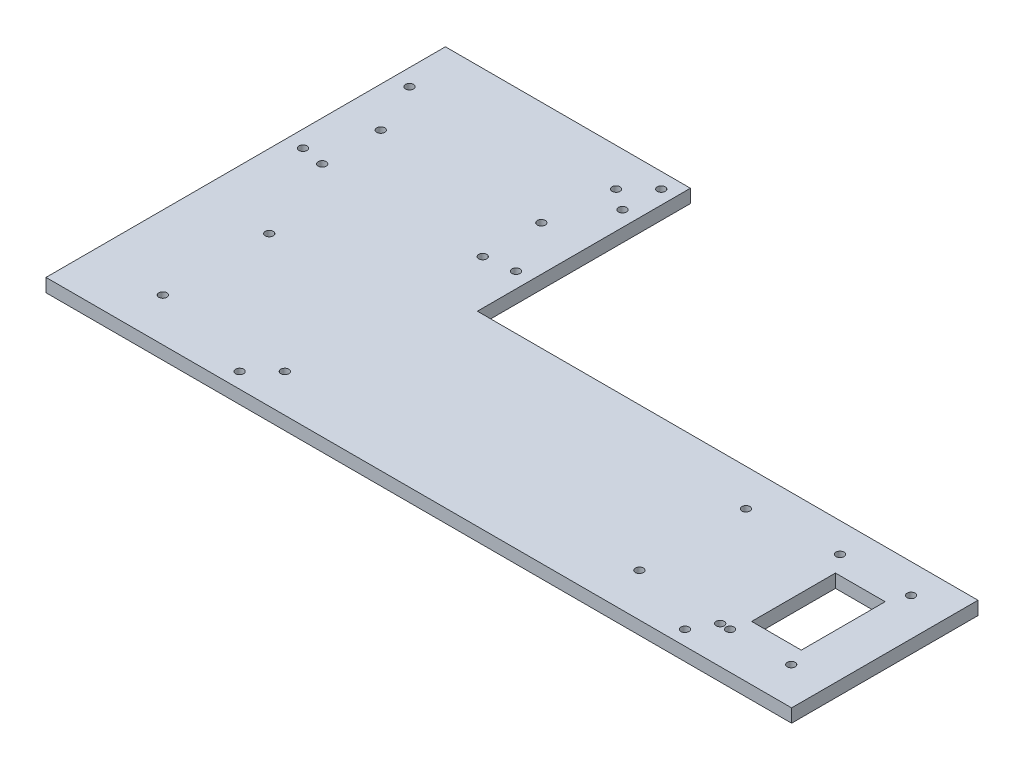
ISO-10303-21;
HEADER;
FILE_DESCRIPTION(('STEP AP214'),'2;1');
FILE_NAME('part.step','',(''),(''),'','','');
FILE_SCHEMA(('AUTOMOTIVE_DESIGN { 1 0 10303 214 1 1 1 1 }'));
ENDSEC;
DATA;
#1=APPLICATION_CONTEXT('core data for automotive mechanical design processes');
#2=APPLICATION_PROTOCOL_DEFINITION('international standard','automotive_design',2000,#1);
#3=PRODUCT_CONTEXT('',#1,'mechanical');
#4=PRODUCT('Part','Part','',(#3));
#5=PRODUCT_RELATED_PRODUCT_CATEGORY('part','',(#4));
#6=PRODUCT_DEFINITION_FORMATION('','',#4);
#7=PRODUCT_DEFINITION_CONTEXT('part definition',#1,'design');
#8=PRODUCT_DEFINITION('design','',#6,#7);
#9=PRODUCT_DEFINITION_SHAPE('','',#8);
#10=(LENGTH_UNIT() NAMED_UNIT(*) SI_UNIT(.MILLI.,.METRE.));
#11=(NAMED_UNIT(*) PLANE_ANGLE_UNIT() SI_UNIT($,.RADIAN.));
#12=(NAMED_UNIT(*) SI_UNIT($,.STERADIAN.) SOLID_ANGLE_UNIT());
#13=UNCERTAINTY_MEASURE_WITH_UNIT(LENGTH_MEASURE(1.E-05),#10,'distance_accuracy_value','');
#14=(GEOMETRIC_REPRESENTATION_CONTEXT(3) GLOBAL_UNCERTAINTY_ASSIGNED_CONTEXT((#13)) GLOBAL_UNIT_ASSIGNED_CONTEXT((#10,
#11,#12)) REPRESENTATION_CONTEXT('',''));
#15=CARTESIAN_POINT('',(0.,0.,0.));
#16=DIRECTION('',(0.,0.,1.));
#17=DIRECTION('',(1.,0.,0.));
#18=AXIS2_PLACEMENT_3D('',#15,#16,#17);
#19=CARTESIAN_POINT('',(0.,5.,60.7829181494663));
#20=DIRECTION('',(0.,0.,-1.));
#21=DIRECTION('',(-1.,0.,0.));
#22=AXIS2_PLACEMENT_3D('',#19,#20,#21);
#23=PLANE('',#22);
#24=DIRECTION('',(1.,0.,0.));
#25=VECTOR('',#24,1.);
#26=CARTESIAN_POINT('',(0.,0.,60.7829181494663));
#27=LINE('',#26,#25);
#28=CARTESIAN_POINT('',(-124.555160142349,0.,60.7829181494663));
#29=VERTEX_POINT('',#28);
#30=CARTESIAN_POINT('',(155.444839857651,0.,60.7829181494663));
#31=VERTEX_POINT('',#30);
#32=EDGE_CURVE('E268',#29,#31,#27,.T.);
#33=ORIENTED_EDGE('',*,*,#32,.T.);
#34=DIRECTION('',(0.,-1.,0.));
#35=VECTOR('',#34,1.);
#36=CARTESIAN_POINT('',(155.444839857651,5.,60.7829181494663));
#37=LINE('',#36,#35);
#38=CARTESIAN_POINT('',(155.444839857651,5.,60.7829181494663));
#39=VERTEX_POINT('',#38);
#40=EDGE_CURVE('E11',#39,#31,#37,.T.);
#41=ORIENTED_EDGE('',*,*,#40,.F.);
#42=DIRECTION('',(1.,0.,0.));
#43=VECTOR('',#42,1.);
#44=CARTESIAN_POINT('',(0.,5.,60.7829181494663));
#45=LINE('',#44,#43);
#46=CARTESIAN_POINT('',(-124.555160142349,5.,60.7829181494663));
#47=VERTEX_POINT('',#46);
#48=EDGE_CURVE('E368',#47,#39,#45,.T.);
#49=ORIENTED_EDGE('',*,*,#48,.F.);
#50=DIRECTION('',(0.,-1.,0.));
#51=VECTOR('',#50,1.);
#52=CARTESIAN_POINT('',(-124.555160142349,5.,60.7829181494663));
#53=LINE('',#52,#51);
#54=EDGE_CURVE('E65',#47,#29,#53,.T.);
#55=ORIENTED_EDGE('',*,*,#54,.T.);
#56=EDGE_LOOP('',(#33,#41,#49,#55));
#57=FACE_BOUND('',#56,.T.);
#58=ADVANCED_FACE('F45',(#57),#23,.F.);
#59=CARTESIAN_POINT('',(155.444839857651,5.,0.));
#60=DIRECTION('',(-1.,0.,0.));
#61=DIRECTION('',(0.,0.,1.));
#62=AXIS2_PLACEMENT_3D('',#59,#60,#61);
#63=PLANE('',#62);
#64=DIRECTION('',(0.,0.,-1.));
#65=VECTOR('',#64,1.);
#66=CARTESIAN_POINT('',(155.444839857651,0.,0.));
#67=LINE('',#66,#65);
#68=CARTESIAN_POINT('',(155.444839857651,0.,-9.21708185053371));
#69=VERTEX_POINT('',#68);
#70=EDGE_CURVE('E271',#31,#69,#67,.T.);
#71=ORIENTED_EDGE('',*,*,#70,.T.);
#72=DIRECTION('',(0.,-1.,0.));
#73=VECTOR('',#72,1.);
#74=CARTESIAN_POINT('',(155.444839857651,5.,-9.21708185053371));
#75=LINE('',#74,#73);
#76=CARTESIAN_POINT('',(155.444839857651,5.,-9.21708185053371));
#77=VERTEX_POINT('',#76);
#78=EDGE_CURVE('E56',#77,#69,#75,.T.);
#79=ORIENTED_EDGE('',*,*,#78,.F.);
#80=DIRECTION('',(0.,0.,-1.));
#81=VECTOR('',#80,1.);
#82=CARTESIAN_POINT('',(155.444839857651,5.,0.));
#83=LINE('',#82,#81);
#84=EDGE_CURVE('E379',#39,#77,#83,.T.);
#85=ORIENTED_EDGE('',*,*,#84,.F.);
#86=ORIENTED_EDGE('',*,*,#40,.T.);
#87=EDGE_LOOP('',(#71,#79,#85,#86));
#88=FACE_BOUND('',#87,.T.);
#89=ADVANCED_FACE('F402',(#88),#63,.F.);
#90=CARTESIAN_POINT('',(0.,5.,-9.21708185053371));
#91=DIRECTION('',(0.,0.,-1.));
#92=DIRECTION('',(-1.,0.,0.));
#93=AXIS2_PLACEMENT_3D('',#90,#91,#92);
#94=PLANE('',#93);
#95=DIRECTION('',(1.,0.,0.));
#96=VECTOR('',#95,1.);
#97=CARTESIAN_POINT('',(0.,0.,-9.21708185053371));
#98=LINE('',#97,#96);
#99=CARTESIAN_POINT('',(-32.5551601423487,0.,-9.21708185053371));
#100=VERTEX_POINT('',#99);
#101=EDGE_CURVE('E275',#100,#69,#98,.T.);
#102=ORIENTED_EDGE('',*,*,#101,.F.);
#103=DIRECTION('',(0.,-1.,0.));
#104=VECTOR('',#103,1.);
#105=CARTESIAN_POINT('',(-32.5551601423487,5.,-9.21708185053371));
#106=LINE('',#105,#104);
#107=CARTESIAN_POINT('',(-32.5551601423487,5.,-9.21708185053371));
#108=VERTEX_POINT('',#107);
#109=EDGE_CURVE('E153',#108,#100,#106,.T.);
#110=ORIENTED_EDGE('',*,*,#109,.F.);
#111=DIRECTION('',(1.,0.,0.));
#112=VECTOR('',#111,1.);
#113=CARTESIAN_POINT('',(0.,5.,-9.21708185053371));
#114=LINE('',#113,#112);
#115=EDGE_CURVE('E141',#108,#77,#114,.T.);
#116=ORIENTED_EDGE('',*,*,#115,.T.);
#117=ORIENTED_EDGE('',*,*,#78,.T.);
#118=EDGE_LOOP('',(#102,#110,#116,#117));
#119=FACE_BOUND('',#118,.T.);
#120=ADVANCED_FACE('F384',(#119),#94,.T.);
#121=CARTESIAN_POINT('',(-32.5551601423487,5.,0.));
#122=DIRECTION('',(-1.,0.,0.));
#123=DIRECTION('',(0.,0.,1.));
#124=AXIS2_PLACEMENT_3D('',#121,#122,#123);
#125=PLANE('',#124);
#126=DIRECTION('',(0.,0.,-1.));
#127=VECTOR('',#126,1.);
#128=CARTESIAN_POINT('',(-32.5551601423487,0.,0.));
#129=LINE('',#128,#127);
#130=CARTESIAN_POINT('',(-32.5551601423487,0.,-89.2170818505337));
#131=VERTEX_POINT('',#130);
#132=EDGE_CURVE('E149',#100,#131,#129,.T.);
#133=ORIENTED_EDGE('',*,*,#132,.T.);
#134=DIRECTION('',(0.,-1.,0.));
#135=VECTOR('',#134,1.);
#136=CARTESIAN_POINT('',(-32.5551601423487,5.,-89.2170818505337));
#137=LINE('',#136,#135);
#138=CARTESIAN_POINT('',(-32.5551601423487,5.,-89.2170818505337));
#139=VERTEX_POINT('',#138);
#140=EDGE_CURVE('E146',#139,#131,#137,.T.);
#141=ORIENTED_EDGE('',*,*,#140,.F.);
#142=DIRECTION('',(0.,0.,-1.));
#143=VECTOR('',#142,1.);
#144=CARTESIAN_POINT('',(-32.5551601423487,5.,0.));
#145=LINE('',#144,#143);
#146=EDGE_CURVE('E132',#108,#139,#145,.T.);
#147=ORIENTED_EDGE('',*,*,#146,.F.);
#148=ORIENTED_EDGE('',*,*,#109,.T.);
#149=EDGE_LOOP('',(#133,#141,#147,#148));
#150=FACE_BOUND('',#149,.T.);
#151=ADVANCED_FACE('F147',(#150),#125,.F.);
#152=CARTESIAN_POINT('',(0.,5.,-89.2170818505337));
#153=DIRECTION('',(0.,0.,-1.));
#154=DIRECTION('',(-1.,0.,0.));
#155=AXIS2_PLACEMENT_3D('',#152,#153,#154);
#156=PLANE('',#155);
#157=DIRECTION('',(1.,0.,0.));
#158=VECTOR('',#157,1.);
#159=CARTESIAN_POINT('',(0.,0.,-89.2170818505337));
#160=LINE('',#159,#158);
#161=CARTESIAN_POINT('',(-124.555160142349,0.,-89.2170818505337));
#162=VERTEX_POINT('',#161);
#163=EDGE_CURVE('E281',#162,#131,#160,.T.);
#164=ORIENTED_EDGE('',*,*,#163,.F.);
#165=DIRECTION('',(0.,-1.,0.));
#166=VECTOR('',#165,1.);
#167=CARTESIAN_POINT('',(-124.555160142349,5.,-89.2170818505337));
#168=LINE('',#167,#166);
#169=CARTESIAN_POINT('',(-124.555160142349,5.,-89.2170818505337));
#170=VERTEX_POINT('',#169);
#171=EDGE_CURVE('E97',#170,#162,#168,.T.);
#172=ORIENTED_EDGE('',*,*,#171,.F.);
#173=DIRECTION('',(1.,0.,0.));
#174=VECTOR('',#173,1.);
#175=CARTESIAN_POINT('',(0.,5.,-89.2170818505337));
#176=LINE('',#175,#174);
#177=EDGE_CURVE('E139',#170,#139,#176,.T.);
#178=ORIENTED_EDGE('',*,*,#177,.T.);
#179=ORIENTED_EDGE('',*,*,#140,.T.);
#180=EDGE_LOOP('',(#164,#172,#178,#179));
#181=FACE_BOUND('',#180,.T.);
#182=ADVANCED_FACE('F155',(#181),#156,.T.);
#183=CARTESIAN_POINT('',(138.489369903126,5.,0.));
#184=DIRECTION('',(-1.,0.,0.));
#185=DIRECTION('',(0.,0.,1.));
#186=AXIS2_PLACEMENT_3D('',#183,#184,#185);
#187=PLANE('',#186);
#188=DIRECTION('',(0.,0.,-1.));
#189=VECTOR('',#188,1.);
#190=CARTESIAN_POINT('',(138.489369903126,0.,0.));
#191=LINE('',#190,#189);
#192=CARTESIAN_POINT('',(138.489369903126,0.,40.1838438087664));
#193=VERTEX_POINT('',#192);
#194=CARTESIAN_POINT('',(138.489369903126,0.,8.69680571503078));
#195=VERTEX_POINT('',#194);
#196=EDGE_CURVE('E252',#193,#195,#191,.T.);
#197=ORIENTED_EDGE('',*,*,#196,.F.);
#198=DIRECTION('',(0.,-1.,0.));
#199=VECTOR('',#198,1.);
#200=CARTESIAN_POINT('',(138.489369903126,5.,40.1838438087664));
#201=LINE('',#200,#199);
#202=CARTESIAN_POINT('',(138.489369903126,5.,40.1838438087664));
#203=VERTEX_POINT('',#202);
#204=EDGE_CURVE('E49',#203,#193,#201,.T.);
#205=ORIENTED_EDGE('',*,*,#204,.F.);
#206=DIRECTION('',(0.,0.,-1.));
#207=VECTOR('',#206,1.);
#208=CARTESIAN_POINT('',(138.489369903126,5.,0.));
#209=LINE('',#208,#207);
#210=CARTESIAN_POINT('',(138.489369903126,5.,8.69680571503078));
#211=VERTEX_POINT('',#210);
#212=EDGE_CURVE('E373',#203,#211,#209,.T.);
#213=ORIENTED_EDGE('',*,*,#212,.T.);
#214=DIRECTION('',(0.,-1.,0.));
#215=VECTOR('',#214,1.);
#216=CARTESIAN_POINT('',(138.489369903126,5.,8.69680571503078));
#217=LINE('',#216,#215);
#218=EDGE_CURVE('E203',#211,#195,#217,.T.);
#219=ORIENTED_EDGE('',*,*,#218,.T.);
#220=EDGE_LOOP('',(#197,#205,#213,#219));
#221=FACE_BOUND('',#220,.T.);
#222=ADVANCED_FACE('F354',(#221),#187,.T.);
#223=CARTESIAN_POINT('',(0.,5.,40.1838438087664));
#224=DIRECTION('',(0.,0.,-1.));
#225=DIRECTION('',(-1.,0.,0.));
#226=AXIS2_PLACEMENT_3D('',#223,#224,#225);
#227=PLANE('',#226);
#228=DIRECTION('',(1.,0.,0.));
#229=VECTOR('',#228,1.);
#230=CARTESIAN_POINT('',(0.,0.,40.1838438087664));
#231=LINE('',#230,#229);
#232=CARTESIAN_POINT('',(119.830384366097,0.,40.1838438087664));
#233=VERTEX_POINT('',#232);
#234=EDGE_CURVE('E256',#233,#193,#231,.T.);
#235=ORIENTED_EDGE('',*,*,#234,.F.);
#236=DIRECTION('',(0.,-1.,0.));
#237=VECTOR('',#236,1.);
#238=CARTESIAN_POINT('',(119.830384366097,5.,40.1838438087664));
#239=LINE('',#238,#237);
#240=CARTESIAN_POINT('',(119.830384366097,5.,40.1838438087664));
#241=VERTEX_POINT('',#240);
#242=EDGE_CURVE('E342',#241,#233,#239,.T.);
#243=ORIENTED_EDGE('',*,*,#242,.F.);
#244=DIRECTION('',(1.,0.,0.));
#245=VECTOR('',#244,1.);
#246=CARTESIAN_POINT('',(0.,5.,40.1838438087664));
#247=LINE('',#246,#245);
#248=EDGE_CURVE('E353',#241,#203,#247,.T.);
#249=ORIENTED_EDGE('',*,*,#248,.T.);
#250=ORIENTED_EDGE('',*,*,#204,.T.);
#251=EDGE_LOOP('',(#235,#243,#249,#250));
#252=FACE_BOUND('',#251,.T.);
#253=ADVANCED_FACE('F351',(#252),#227,.T.);
#254=CARTESIAN_POINT('',(119.830384366097,5.,0.));
#255=DIRECTION('',(-1.,0.,0.));
#256=DIRECTION('',(0.,0.,1.));
#257=AXIS2_PLACEMENT_3D('',#254,#255,#256);
#258=PLANE('',#257);
#259=DIRECTION('',(0.,0.,-1.));
#260=VECTOR('',#259,1.);
#261=CARTESIAN_POINT('',(119.830384366097,0.,0.));
#262=LINE('',#261,#260);
#263=CARTESIAN_POINT('',(119.830384366097,0.,8.69680571503078));
#264=VERTEX_POINT('',#263);
#265=EDGE_CURVE('E260',#233,#264,#262,.T.);
#266=ORIENTED_EDGE('',*,*,#265,.T.);
#267=DIRECTION('',(0.,-1.,0.));
#268=VECTOR('',#267,1.);
#269=CARTESIAN_POINT('',(119.830384366097,5.,8.69680571503078));
#270=LINE('',#269,#268);
#271=CARTESIAN_POINT('',(119.830384366097,5.,8.69680571503078));
#272=VERTEX_POINT('',#271);
#273=EDGE_CURVE('E339',#272,#264,#270,.T.);
#274=ORIENTED_EDGE('',*,*,#273,.F.);
#275=DIRECTION('',(0.,0.,-1.));
#276=VECTOR('',#275,1.);
#277=CARTESIAN_POINT('',(119.830384366097,5.,0.));
#278=LINE('',#277,#276);
#279=EDGE_CURVE('E362',#241,#272,#278,.T.);
#280=ORIENTED_EDGE('',*,*,#279,.F.);
#281=ORIENTED_EDGE('',*,*,#242,.T.);
#282=EDGE_LOOP('',(#266,#274,#280,#281));
#283=FACE_BOUND('',#282,.T.);
#284=ADVANCED_FACE('F360',(#283),#258,.F.);
#285=CARTESIAN_POINT('',(-46.2375364699108,5.,-74.9744411634144));
#286=DIRECTION('',(0.,-1.,0.));
#287=DIRECTION('',(0.,0.,-1.));
#288=AXIS2_PLACEMENT_3D('',#285,#286,#287);
#289=CYLINDRICAL_SURFACE('',#288,1.5);
#290=CARTESIAN_POINT('',(-46.2375364699108,5.,-74.9744411634144));
#291=DIRECTION('',(0.,1.,0.));
#292=DIRECTION('',(0.,0.,1.));
#293=AXIS2_PLACEMENT_3D('',#290,#291,#292);
#294=CIRCLE('',#293,1.5);
#295=CARTESIAN_POINT('',(-46.2375364699108,5.,-73.4744411634144));
#296=VERTEX_POINT('',#295);
#297=EDGE_CURVE('E195',#296,#296,#294,.T.);
#298=ORIENTED_EDGE('',*,*,#297,.T.);
#299=EDGE_LOOP('',(#298));
#300=FACE_BOUND('',#299,.T.);
#301=CARTESIAN_POINT('',(-46.2375364699108,0.,-74.9744411634144));
#302=DIRECTION('',(0.,1.,0.));
#303=DIRECTION('',(0.,0.,1.));
#304=AXIS2_PLACEMENT_3D('',#301,#302,#303);
#305=CIRCLE('',#304,1.5);
#306=CARTESIAN_POINT('',(-46.2375364699108,0.,-73.4744411634144));
#307=VERTEX_POINT('',#306);
#308=EDGE_CURVE('E320',#307,#307,#305,.T.);
#309=ORIENTED_EDGE('',*,*,#308,.F.);
#310=EDGE_LOOP('',(#309));
#311=FACE_BOUND('',#310,.T.);
#312=ADVANCED_FACE('F413',(#300,#311),#289,.F.);
#313=CARTESIAN_POINT('',(-118.326917326032,5.,-69.4952757105542));
#314=DIRECTION('',(0.,-1.,0.));
#315=DIRECTION('',(0.,0.,-1.));
#316=AXIS2_PLACEMENT_3D('',#313,#314,#315);
#317=CYLINDRICAL_SURFACE('',#316,1.50000000000001);
#318=CARTESIAN_POINT('',(-118.326917326032,5.,-69.4952757105542));
#319=DIRECTION('',(0.,1.,0.));
#320=DIRECTION('',(0.,0.,1.));
#321=AXIS2_PLACEMENT_3D('',#318,#319,#320);
#322=CIRCLE('',#321,1.50000000000001);
#323=CARTESIAN_POINT('',(-118.326917326032,5.,-67.9952757105542));
#324=VERTEX_POINT('',#323);
#325=EDGE_CURVE('E191',#324,#324,#322,.T.);
#326=ORIENTED_EDGE('',*,*,#325,.T.);
#327=EDGE_LOOP('',(#326));
#328=FACE_BOUND('',#327,.T.);
#329=CARTESIAN_POINT('',(-118.326917326032,0.,-69.4952757105542));
#330=DIRECTION('',(0.,1.,0.));
#331=DIRECTION('',(0.,0.,1.));
#332=AXIS2_PLACEMENT_3D('',#329,#330,#331);
#333=CIRCLE('',#332,1.50000000000001);
#334=CARTESIAN_POINT('',(-118.326917326032,0.,-67.9952757105542));
#335=VERTEX_POINT('',#334);
#336=EDGE_CURVE('E316',#335,#335,#333,.T.);
#337=ORIENTED_EDGE('',*,*,#336,.F.);
#338=EDGE_LOOP('',(#337));
#339=FACE_BOUND('',#338,.T.);
#340=ADVANCED_FACE('F514',(#328,#339),#317,.F.);
#341=CARTESIAN_POINT('',(-118.326917326032,5.,-29.4952757105542));
#342=DIRECTION('',(0.,-1.,0.));
#343=DIRECTION('',(0.,0.,-1.));
#344=AXIS2_PLACEMENT_3D('',#341,#342,#343);
#345=CYLINDRICAL_SURFACE('',#344,1.5);
#346=CARTESIAN_POINT('',(-118.326917326032,5.,-29.4952757105542));
#347=DIRECTION('',(0.,1.,0.));
#348=DIRECTION('',(0.,0.,1.));
#349=AXIS2_PLACEMENT_3D('',#346,#347,#348);
#350=CIRCLE('',#349,1.5);
#351=CARTESIAN_POINT('',(-118.326917326032,5.,-27.9952757105542));
#352=VERTEX_POINT('',#351);
#353=EDGE_CURVE('E187',#352,#352,#350,.T.);
#354=ORIENTED_EDGE('',*,*,#353,.T.);
#355=EDGE_LOOP('',(#354));
#356=FACE_BOUND('',#355,.T.);
#357=CARTESIAN_POINT('',(-118.326917326032,0.,-29.4952757105542));
#358=DIRECTION('',(0.,1.,0.));
#359=DIRECTION('',(0.,0.,1.));
#360=AXIS2_PLACEMENT_3D('',#357,#358,#359);
#361=CIRCLE('',#360,1.5);
#362=CARTESIAN_POINT('',(-118.326917326032,0.,-27.9952757105542));
#363=VERTEX_POINT('',#362);
#364=EDGE_CURVE('E312',#363,#363,#361,.T.);
#365=ORIENTED_EDGE('',*,*,#364,.F.);
#366=EDGE_LOOP('',(#365));
#367=FACE_BOUND('',#366,.T.);
#368=ADVANCED_FACE('F518',(#356,#367),#345,.F.);
#369=CARTESIAN_POINT('',(-38.3269173260317,5.,-29.4952757105542));
#370=DIRECTION('',(0.,-1.,0.));
#371=DIRECTION('',(0.,0.,-1.));
#372=AXIS2_PLACEMENT_3D('',#369,#370,#371);
#373=CYLINDRICAL_SURFACE('',#372,1.5);
#374=CARTESIAN_POINT('',(-38.3269173260317,5.,-29.4952757105542));
#375=DIRECTION('',(0.,1.,0.));
#376=DIRECTION('',(0.,0.,1.));
#377=AXIS2_PLACEMENT_3D('',#374,#375,#376);
#378=CIRCLE('',#377,1.5);
#379=CARTESIAN_POINT('',(-38.3269173260317,5.,-27.9952757105542));
#380=VERTEX_POINT('',#379);
#381=EDGE_CURVE('E183',#380,#380,#378,.T.);
#382=ORIENTED_EDGE('',*,*,#381,.T.);
#383=EDGE_LOOP('',(#382));
#384=FACE_BOUND('',#383,.T.);
#385=CARTESIAN_POINT('',(-38.3269173260317,0.,-29.4952757105542));
#386=DIRECTION('',(0.,1.,0.));
#387=DIRECTION('',(0.,0.,1.));
#388=AXIS2_PLACEMENT_3D('',#385,#386,#387);
#389=CIRCLE('',#388,1.5);
#390=CARTESIAN_POINT('',(-38.3269173260317,0.,-27.9952757105542));
#391=VERTEX_POINT('',#390);
#392=EDGE_CURVE('E308',#391,#391,#389,.T.);
#393=ORIENTED_EDGE('',*,*,#392,.F.);
#394=EDGE_LOOP('',(#393));
#395=FACE_BOUND('',#394,.T.);
#396=ADVANCED_FACE('F522',(#384,#395),#373,.F.);
#397=CARTESIAN_POINT('',(-38.3269173260317,5.,-69.4952757105542));
#398=DIRECTION('',(0.,-1.,0.));
#399=DIRECTION('',(0.,0.,-1.));
#400=AXIS2_PLACEMENT_3D('',#397,#398,#399);
#401=CYLINDRICAL_SURFACE('',#400,1.5);
#402=CARTESIAN_POINT('',(-38.3269173260317,5.,-69.4952757105542));
#403=DIRECTION('',(0.,1.,0.));
#404=DIRECTION('',(0.,0.,1.));
#405=AXIS2_PLACEMENT_3D('',#402,#403,#404);
#406=CIRCLE('',#405,1.5);
#407=CARTESIAN_POINT('',(-38.3269173260317,5.,-67.9952757105542));
#408=VERTEX_POINT('',#407);
#409=EDGE_CURVE('E179',#408,#408,#406,.T.);
#410=ORIENTED_EDGE('',*,*,#409,.T.);
#411=EDGE_LOOP('',(#410));
#412=FACE_BOUND('',#411,.T.);
#413=CARTESIAN_POINT('',(-38.3269173260317,0.,-69.4952757105542));
#414=DIRECTION('',(0.,1.,0.));
#415=DIRECTION('',(0.,0.,1.));
#416=AXIS2_PLACEMENT_3D('',#413,#414,#415);
#417=CIRCLE('',#416,1.5);
#418=CARTESIAN_POINT('',(-38.3269173260317,0.,-67.9952757105542));
#419=VERTEX_POINT('',#418);
#420=EDGE_CURVE('E304',#419,#419,#417,.T.);
#421=ORIENTED_EDGE('',*,*,#420,.F.);
#422=EDGE_LOOP('',(#421));
#423=FACE_BOUND('',#422,.T.);
#424=ADVANCED_FACE('F526',(#412,#423),#401,.F.);
#425=CARTESIAN_POINT('',(-109.616514697258,5.,-49.9907257311618));
#426=DIRECTION('',(0.,-1.,0.));
#427=DIRECTION('',(0.,0.,-1.));
#428=AXIS2_PLACEMENT_3D('',#425,#426,#427);
#429=CYLINDRICAL_SURFACE('',#428,1.50000000000001);
#430=CARTESIAN_POINT('',(-109.616514697258,5.,-49.9907257311618));
#431=DIRECTION('',(0.,1.,0.));
#432=DIRECTION('',(0.,0.,1.));
#433=AXIS2_PLACEMENT_3D('',#430,#431,#432);
#434=CIRCLE('',#433,1.50000000000001);
#435=CARTESIAN_POINT('',(-109.616514697258,5.,-48.4907257311618));
#436=VERTEX_POINT('',#435);
#437=EDGE_CURVE('E175',#436,#436,#434,.T.);
#438=ORIENTED_EDGE('',*,*,#437,.T.);
#439=EDGE_LOOP('',(#438));
#440=FACE_BOUND('',#439,.T.);
#441=CARTESIAN_POINT('',(-109.616514697258,0.,-49.9907257311618));
#442=DIRECTION('',(0.,1.,0.));
#443=DIRECTION('',(0.,0.,1.));
#444=AXIS2_PLACEMENT_3D('',#441,#442,#443);
#445=CIRCLE('',#444,1.50000000000001);
#446=CARTESIAN_POINT('',(-109.616514697258,0.,-48.4907257311618));
#447=VERTEX_POINT('',#446);
#448=EDGE_CURVE('E300',#447,#447,#445,.T.);
#449=ORIENTED_EDGE('',*,*,#448,.F.);
#450=EDGE_LOOP('',(#449));
#451=FACE_BOUND('',#450,.T.);
#452=ADVANCED_FACE('F530',(#440,#451),#429,.F.);
#453=CARTESIAN_POINT('',(-109.616514697258,5.,-27.9907257311618));
#454=DIRECTION('',(0.,-1.,0.));
#455=DIRECTION('',(0.,0.,-1.));
#456=AXIS2_PLACEMENT_3D('',#453,#454,#455);
#457=CYLINDRICAL_SURFACE('',#456,1.5);
#458=CARTESIAN_POINT('',(-109.616514697258,5.,-27.9907257311618));
#459=DIRECTION('',(0.,1.,0.));
#460=DIRECTION('',(0.,0.,1.));
#461=AXIS2_PLACEMENT_3D('',#458,#459,#460);
#462=CIRCLE('',#461,1.5);
#463=CARTESIAN_POINT('',(-109.616514697258,5.,-26.4907257311618));
#464=VERTEX_POINT('',#463);
#465=EDGE_CURVE('E171',#464,#464,#462,.T.);
#466=ORIENTED_EDGE('',*,*,#465,.T.);
#467=EDGE_LOOP('',(#466));
#468=FACE_BOUND('',#467,.T.);
#469=CARTESIAN_POINT('',(-109.616514697258,0.,-27.9907257311618));
#470=DIRECTION('',(0.,1.,0.));
#471=DIRECTION('',(0.,0.,1.));
#472=AXIS2_PLACEMENT_3D('',#469,#470,#471);
#473=CIRCLE('',#472,1.5);
#474=CARTESIAN_POINT('',(-109.616514697258,0.,-26.4907257311618));
#475=VERTEX_POINT('',#474);
#476=EDGE_CURVE('E296',#475,#475,#473,.T.);
#477=ORIENTED_EDGE('',*,*,#476,.F.);
#478=EDGE_LOOP('',(#477));
#479=FACE_BOUND('',#478,.T.);
#480=ADVANCED_FACE('F534',(#468,#479),#457,.F.);
#481=CARTESIAN_POINT('',(-49.316514697258,5.,-49.9907257311618));
#482=DIRECTION('',(0.,-1.,0.));
#483=DIRECTION('',(0.,0.,-1.));
#484=AXIS2_PLACEMENT_3D('',#481,#482,#483);
#485=CYLINDRICAL_SURFACE('',#484,1.5);
#486=CARTESIAN_POINT('',(-49.316514697258,5.,-49.9907257311618));
#487=DIRECTION('',(0.,1.,0.));
#488=DIRECTION('',(0.,0.,1.));
#489=AXIS2_PLACEMENT_3D('',#486,#487,#488);
#490=CIRCLE('',#489,1.5);
#491=CARTESIAN_POINT('',(-49.316514697258,5.,-48.4907257311618));
#492=VERTEX_POINT('',#491);
#493=EDGE_CURVE('E167',#492,#492,#490,.T.);
#494=ORIENTED_EDGE('',*,*,#493,.T.);
#495=EDGE_LOOP('',(#494));
#496=FACE_BOUND('',#495,.T.);
#497=CARTESIAN_POINT('',(-49.316514697258,0.,-49.9907257311618));
#498=DIRECTION('',(0.,1.,0.));
#499=DIRECTION('',(0.,0.,1.));
#500=AXIS2_PLACEMENT_3D('',#497,#498,#499);
#501=CIRCLE('',#500,1.5);
#502=CARTESIAN_POINT('',(-49.316514697258,0.,-48.4907257311618));
#503=VERTEX_POINT('',#502);
#504=EDGE_CURVE('E292',#503,#503,#501,.T.);
#505=ORIENTED_EDGE('',*,*,#504,.F.);
#506=EDGE_LOOP('',(#505));
#507=FACE_BOUND('',#506,.T.);
#508=ADVANCED_FACE('F397',(#496,#507),#485,.F.);
#509=CARTESIAN_POINT('',(-49.316514697258,5.,-27.9907257311618));
#510=DIRECTION('',(0.,-1.,0.));
#511=DIRECTION('',(0.,0.,-1.));
#512=AXIS2_PLACEMENT_3D('',#509,#510,#511);
#513=CYLINDRICAL_SURFACE('',#512,1.5);
#514=CARTESIAN_POINT('',(-49.316514697258,5.,-27.9907257311618));
#515=DIRECTION('',(0.,1.,0.));
#516=DIRECTION('',(0.,0.,1.));
#517=AXIS2_PLACEMENT_3D('',#514,#515,#516);
#518=CIRCLE('',#517,1.5);
#519=CARTESIAN_POINT('',(-49.316514697258,5.,-26.4907257311618));
#520=VERTEX_POINT('',#519);
#521=EDGE_CURVE('E160',#520,#520,#518,.T.);
#522=ORIENTED_EDGE('',*,*,#521,.T.);
#523=EDGE_LOOP('',(#522));
#524=FACE_BOUND('',#523,.T.);
#525=CARTESIAN_POINT('',(-49.316514697258,0.,-27.9907257311618));
#526=DIRECTION('',(0.,1.,0.));
#527=DIRECTION('',(0.,0.,1.));
#528=AXIS2_PLACEMENT_3D('',#525,#526,#527);
#529=CIRCLE('',#528,1.5);
#530=CARTESIAN_POINT('',(-49.316514697258,0.,-26.4907257311618));
#531=VERTEX_POINT('',#530);
#532=EDGE_CURVE('E288',#531,#531,#529,.T.);
#533=ORIENTED_EDGE('',*,*,#532,.F.);
#534=EDGE_LOOP('',(#533));
#535=FACE_BOUND('',#534,.T.);
#536=ADVANCED_FACE('F389',(#524,#535),#513,.F.);
#537=CARTESIAN_POINT('',(-124.555160142349,5.,0.));
#538=DIRECTION('',(-1.,0.,0.));
#539=DIRECTION('',(0.,0.,1.));
#540=AXIS2_PLACEMENT_3D('',#537,#538,#539);
#541=PLANE('',#540);
#542=DIRECTION('',(0.,0.,-1.));
#543=VECTOR('',#542,1.);
#544=CARTESIAN_POINT('',(-124.555160142349,0.,0.));
#545=LINE('',#544,#543);
#546=EDGE_CURVE('E284',#29,#162,#545,.T.);
#547=ORIENTED_EDGE('',*,*,#546,.F.);
#548=ORIENTED_EDGE('',*,*,#54,.F.);
#549=DIRECTION('',(0.,0.,-1.));
#550=VECTOR('',#549,1.);
#551=CARTESIAN_POINT('',(-124.555160142349,5.,0.));
#552=LINE('',#551,#550);
#553=EDGE_CURVE('E157',#47,#170,#552,.T.);
#554=ORIENTED_EDGE('',*,*,#553,.T.);
#555=ORIENTED_EDGE('',*,*,#171,.T.);
#556=EDGE_LOOP('',(#547,#548,#554,#555));
#557=FACE_BOUND('',#556,.T.);
#558=ADVANCED_FACE('F387',(#557),#541,.T.);
#559=CARTESIAN_POINT('',(0.,5.,8.69680571503078));
#560=DIRECTION('',(0.,0.,-1.));
#561=DIRECTION('',(-1.,0.,0.));
#562=AXIS2_PLACEMENT_3D('',#559,#560,#561);
#563=PLANE('',#562);
#564=DIRECTION('',(1.,0.,0.));
#565=VECTOR('',#564,1.);
#566=CARTESIAN_POINT('',(0.,0.,8.69680571503078));
#567=LINE('',#566,#565);
#568=EDGE_CURVE('E264',#264,#195,#567,.T.);
#569=ORIENTED_EDGE('',*,*,#568,.T.);
#570=ORIENTED_EDGE('',*,*,#218,.F.);
#571=DIRECTION('',(1.,0.,0.));
#572=VECTOR('',#571,1.);
#573=CARTESIAN_POINT('',(0.,5.,8.69680571503078));
#574=LINE('',#573,#572);
#575=EDGE_CURVE('E365',#272,#211,#574,.T.);
#576=ORIENTED_EDGE('',*,*,#575,.F.);
#577=ORIENTED_EDGE('',*,*,#273,.T.);
#578=EDGE_LOOP('',(#569,#570,#576,#577));
#579=FACE_BOUND('',#578,.T.);
#580=ADVANCED_FACE('F364',(#579),#563,.F.);
#581=CARTESIAN_POINT('',(141.300092758163,5.,46.7829181494663));
#582=DIRECTION('',(0.,-1.,0.));
#583=DIRECTION('',(0.,0.,-1.));
#584=AXIS2_PLACEMENT_3D('',#581,#582,#583);
#585=CYLINDRICAL_SURFACE('',#584,1.5);
#586=CARTESIAN_POINT('',(141.300092758163,5.,46.7829181494663));
#587=DIRECTION('',(0.,1.,0.));
#588=DIRECTION('',(0.,0.,1.));
#589=AXIS2_PLACEMENT_3D('',#586,#587,#588);
#590=CIRCLE('',#589,1.5);
#591=CARTESIAN_POINT('',(141.300092758163,5.,48.2829181494663));
#592=VERTEX_POINT('',#591);
#593=EDGE_CURVE('E907',#592,#592,#590,.T.);
#594=ORIENTED_EDGE('',*,*,#593,.T.);
#595=EDGE_LOOP('',(#594));
#596=FACE_BOUND('',#595,.T.);
#597=CARTESIAN_POINT('',(141.300092758163,0.,46.7829181494663));
#598=DIRECTION('',(0.,1.,0.));
#599=DIRECTION('',(0.,0.,1.));
#600=AXIS2_PLACEMENT_3D('',#597,#598,#599);
#601=CIRCLE('',#600,1.5);
#602=CARTESIAN_POINT('',(141.300092758163,0.,48.2829181494663));
#603=VERTEX_POINT('',#602);
#604=EDGE_CURVE('E248',#603,#603,#601,.T.);
#605=ORIENTED_EDGE('',*,*,#604,.F.);
#606=EDGE_LOOP('',(#605));
#607=FACE_BOUND('',#606,.T.);
#608=ADVANCED_FACE('F395',(#596,#607),#585,.F.);
#609=CARTESIAN_POINT('',(141.300092758163,5.,1.78291814946631));
#610=DIRECTION('',(0.,-1.,0.));
#611=DIRECTION('',(0.,0.,-1.));
#612=AXIS2_PLACEMENT_3D('',#609,#610,#611);
#613=CYLINDRICAL_SURFACE('',#612,1.5);
#614=CARTESIAN_POINT('',(141.300092758163,5.,1.78291814946631));
#615=DIRECTION('',(0.,1.,0.));
#616=DIRECTION('',(0.,0.,1.));
#617=AXIS2_PLACEMENT_3D('',#614,#615,#616);
#618=CIRCLE('',#617,1.5);
#619=CARTESIAN_POINT('',(141.300092758163,5.,3.28291814946631));
#620=VERTEX_POINT('',#619);
#621=EDGE_CURVE('E904',#620,#620,#618,.T.);
#622=ORIENTED_EDGE('',*,*,#621,.T.);
#623=EDGE_LOOP('',(#622));
#624=FACE_BOUND('',#623,.T.);
#625=CARTESIAN_POINT('',(141.300092758163,0.,1.78291814946631));
#626=DIRECTION('',(0.,1.,0.));
#627=DIRECTION('',(0.,0.,1.));
#628=AXIS2_PLACEMENT_3D('',#625,#626,#627);
#629=CIRCLE('',#628,1.5);
#630=CARTESIAN_POINT('',(141.300092758163,0.,3.28291814946631));
#631=VERTEX_POINT('',#630);
#632=EDGE_CURVE('E244',#631,#631,#629,.T.);
#633=ORIENTED_EDGE('',*,*,#632,.F.);
#634=EDGE_LOOP('',(#633));
#635=FACE_BOUND('',#634,.T.);
#636=ADVANCED_FACE('F420',(#624,#635),#613,.F.);
#637=CARTESIAN_POINT('',(114.620218271132,5.,1.78291814946631));
#638=DIRECTION('',(0.,-1.,0.));
#639=DIRECTION('',(0.,0.,-1.));
#640=AXIS2_PLACEMENT_3D('',#637,#638,#639);
#641=CYLINDRICAL_SURFACE('',#640,1.5);
#642=CARTESIAN_POINT('',(114.620218271132,5.,1.78291814946631));
#643=DIRECTION('',(0.,1.,0.));
#644=DIRECTION('',(0.,0.,1.));
#645=AXIS2_PLACEMENT_3D('',#642,#643,#644);
#646=CIRCLE('',#645,1.5);
#647=CARTESIAN_POINT('',(114.620218271132,5.,3.28291814946631));
#648=VERTEX_POINT('',#647);
#649=EDGE_CURVE('E900',#648,#648,#646,.T.);
#650=ORIENTED_EDGE('',*,*,#649,.T.);
#651=EDGE_LOOP('',(#650));
#652=FACE_BOUND('',#651,.T.);
#653=CARTESIAN_POINT('',(114.620218271132,0.,1.78291814946631));
#654=DIRECTION('',(0.,1.,0.));
#655=DIRECTION('',(0.,0.,1.));
#656=AXIS2_PLACEMENT_3D('',#653,#654,#655);
#657=CIRCLE('',#656,1.5);
#658=CARTESIAN_POINT('',(114.620218271132,0.,3.28291814946631));
#659=VERTEX_POINT('',#658);
#660=EDGE_CURVE('E240',#659,#659,#657,.T.);
#661=ORIENTED_EDGE('',*,*,#660,.F.);
#662=EDGE_LOOP('',(#661));
#663=FACE_BOUND('',#662,.T.);
#664=ADVANCED_FACE('F424',(#652,#663),#641,.F.);
#665=CARTESIAN_POINT('',(114.620218271132,5.,46.7829181494663));
#666=DIRECTION('',(0.,-1.,0.));
#667=DIRECTION('',(0.,0.,-1.));
#668=AXIS2_PLACEMENT_3D('',#665,#666,#667);
#669=CYLINDRICAL_SURFACE('',#668,1.5);
#670=CARTESIAN_POINT('',(114.620218271132,5.,46.7829181494663));
#671=DIRECTION('',(0.,1.,0.));
#672=DIRECTION('',(0.,0.,1.));
#673=AXIS2_PLACEMENT_3D('',#670,#671,#672);
#674=CIRCLE('',#673,1.5);
#675=CARTESIAN_POINT('',(114.620218271132,5.,48.2829181494663));
#676=VERTEX_POINT('',#675);
#677=EDGE_CURVE('E896',#676,#676,#674,.T.);
#678=ORIENTED_EDGE('',*,*,#677,.T.);
#679=EDGE_LOOP('',(#678));
#680=FACE_BOUND('',#679,.T.);
#681=CARTESIAN_POINT('',(114.620218271132,0.,46.7829181494663));
#682=DIRECTION('',(0.,1.,0.));
#683=DIRECTION('',(0.,0.,1.));
#684=AXIS2_PLACEMENT_3D('',#681,#682,#683);
#685=CIRCLE('',#684,1.5);
#686=CARTESIAN_POINT('',(114.620218271132,0.,48.2829181494663));
#687=VERTEX_POINT('',#686);
#688=EDGE_CURVE('E236',#687,#687,#685,.T.);
#689=ORIENTED_EDGE('',*,*,#688,.F.);
#690=EDGE_LOOP('',(#689));
#691=FACE_BOUND('',#690,.T.);
#692=ADVANCED_FACE('F428',(#680,#691),#669,.F.);
#693=CARTESIAN_POINT('',(82.1195193397718,5.,44.6239065738677));
#694=DIRECTION('',(0.,-1.,0.));
#695=DIRECTION('',(0.,0.,-1.));
#696=AXIS2_PLACEMENT_3D('',#693,#694,#695);
#697=CYLINDRICAL_SURFACE('',#696,1.5);
#698=CARTESIAN_POINT('',(82.1195193397718,5.,44.6239065738677));
#699=DIRECTION('',(0.,1.,0.));
#700=DIRECTION('',(0.,0.,1.));
#701=AXIS2_PLACEMENT_3D('',#698,#699,#700);
#702=CIRCLE('',#701,1.5);
#703=CARTESIAN_POINT('',(82.1195193397718,5.,46.1239065738677));
#704=VERTEX_POINT('',#703);
#705=EDGE_CURVE('E892',#704,#704,#702,.T.);
#706=ORIENTED_EDGE('',*,*,#705,.T.);
#707=EDGE_LOOP('',(#706));
#708=FACE_BOUND('',#707,.T.);
#709=CARTESIAN_POINT('',(82.1195193397718,0.,44.6239065738677));
#710=DIRECTION('',(0.,1.,0.));
#711=DIRECTION('',(0.,0.,1.));
#712=AXIS2_PLACEMENT_3D('',#709,#710,#711);
#713=CIRCLE('',#712,1.5);
#714=CARTESIAN_POINT('',(82.1195193397718,0.,46.1239065738677));
#715=VERTEX_POINT('',#714);
#716=EDGE_CURVE('E232',#715,#715,#713,.T.);
#717=ORIENTED_EDGE('',*,*,#716,.F.);
#718=EDGE_LOOP('',(#717));
#719=FACE_BOUND('',#718,.T.);
#720=ADVANCED_FACE('F432',(#708,#719),#697,.F.);
#721=CARTESIAN_POINT('',(82.1195193397718,5.,4.62390657386765));
#722=DIRECTION('',(0.,-1.,0.));
#723=DIRECTION('',(0.,0.,-1.));
#724=AXIS2_PLACEMENT_3D('',#721,#722,#723);
#725=CYLINDRICAL_SURFACE('',#724,1.5);
#726=CARTESIAN_POINT('',(82.1195193397718,5.,4.62390657386765));
#727=DIRECTION('',(0.,1.,0.));
#728=DIRECTION('',(0.,0.,1.));
#729=AXIS2_PLACEMENT_3D('',#726,#727,#728);
#730=CIRCLE('',#729,1.5);
#731=CARTESIAN_POINT('',(82.1195193397718,5.,6.12390657386765));
#732=VERTEX_POINT('',#731);
#733=EDGE_CURVE('E888',#732,#732,#730,.T.);
#734=ORIENTED_EDGE('',*,*,#733,.T.);
#735=EDGE_LOOP('',(#734));
#736=FACE_BOUND('',#735,.T.);
#737=CARTESIAN_POINT('',(82.1195193397718,0.,4.62390657386765));
#738=DIRECTION('',(0.,1.,0.));
#739=DIRECTION('',(0.,0.,1.));
#740=AXIS2_PLACEMENT_3D('',#737,#738,#739);
#741=CIRCLE('',#740,1.5);
#742=CARTESIAN_POINT('',(82.1195193397718,0.,6.12390657386765));
#743=VERTEX_POINT('',#742);
#744=EDGE_CURVE('E228',#743,#743,#741,.T.);
#745=ORIENTED_EDGE('',*,*,#744,.F.);
#746=EDGE_LOOP('',(#745));
#747=FACE_BOUND('',#746,.T.);
#748=ADVANCED_FACE('F436',(#736,#747),#725,.F.);
#749=CARTESIAN_POINT('',(-96.8804806602282,5.,44.5793714473722));
#750=DIRECTION('',(0.,-1.,0.));
#751=DIRECTION('',(0.,0.,-1.));
#752=AXIS2_PLACEMENT_3D('',#749,#750,#751);
#753=CYLINDRICAL_SURFACE('',#752,1.5);
#754=CARTESIAN_POINT('',(-96.8804806602282,5.,44.5793714473722));
#755=DIRECTION('',(0.,1.,0.));
#756=DIRECTION('',(0.,0.,1.));
#757=AXIS2_PLACEMENT_3D('',#754,#755,#756);
#758=CIRCLE('',#757,1.5);
#759=CARTESIAN_POINT('',(-96.8804806602282,5.,46.0793714473722));
#760=VERTEX_POINT('',#759);
#761=EDGE_CURVE('E884',#760,#760,#758,.T.);
#762=ORIENTED_EDGE('',*,*,#761,.T.);
#763=EDGE_LOOP('',(#762));
#764=FACE_BOUND('',#763,.T.);
#765=CARTESIAN_POINT('',(-96.8804806602282,0.,44.5793714473722));
#766=DIRECTION('',(0.,1.,0.));
#767=DIRECTION('',(0.,0.,1.));
#768=AXIS2_PLACEMENT_3D('',#765,#766,#767);
#769=CIRCLE('',#768,1.5);
#770=CARTESIAN_POINT('',(-96.8804806602282,0.,46.0793714473722));
#771=VERTEX_POINT('',#770);
#772=EDGE_CURVE('E224',#771,#771,#769,.T.);
#773=ORIENTED_EDGE('',*,*,#772,.F.);
#774=EDGE_LOOP('',(#773));
#775=FACE_BOUND('',#774,.T.);
#776=ADVANCED_FACE('F440',(#764,#775),#753,.F.);
#777=CARTESIAN_POINT('',(-96.8804806602282,5.,4.62390657386766));
#778=DIRECTION('',(0.,-1.,0.));
#779=DIRECTION('',(0.,0.,-1.));
#780=AXIS2_PLACEMENT_3D('',#777,#778,#779);
#781=CYLINDRICAL_SURFACE('',#780,1.5);
#782=CARTESIAN_POINT('',(-96.8804806602282,5.,4.62390657386766));
#783=DIRECTION('',(0.,1.,0.));
#784=DIRECTION('',(0.,0.,1.));
#785=AXIS2_PLACEMENT_3D('',#782,#783,#784);
#786=CIRCLE('',#785,1.5);
#787=CARTESIAN_POINT('',(-96.8804806602282,5.,6.12390657386765));
#788=VERTEX_POINT('',#787);
#789=EDGE_CURVE('E880',#788,#788,#786,.T.);
#790=ORIENTED_EDGE('',*,*,#789,.T.);
#791=EDGE_LOOP('',(#790));
#792=FACE_BOUND('',#791,.T.);
#793=CARTESIAN_POINT('',(-96.8804806602282,0.,4.62390657386766));
#794=DIRECTION('',(0.,1.,0.));
#795=DIRECTION('',(0.,0.,1.));
#796=AXIS2_PLACEMENT_3D('',#793,#794,#795);
#797=CIRCLE('',#796,1.5);
#798=CARTESIAN_POINT('',(-96.8804806602282,0.,6.12390657386765));
#799=VERTEX_POINT('',#798);
#800=EDGE_CURVE('E220',#799,#799,#797,.T.);
#801=ORIENTED_EDGE('',*,*,#800,.F.);
#802=EDGE_LOOP('',(#801));
#803=FACE_BOUND('',#802,.T.);
#804=ADVANCED_FACE('F444',(#792,#803),#781,.F.);
#805=CARTESIAN_POINT('',(-49.1246983337338,5.,46.5402774623471));
#806=DIRECTION('',(0.,-1.,0.));
#807=DIRECTION('',(0.,0.,-1.));
#808=AXIS2_PLACEMENT_3D('',#805,#806,#807);
#809=CYLINDRICAL_SURFACE('',#808,1.5);
#810=CARTESIAN_POINT('',(-49.1246983337338,5.,46.5402774623471));
#811=DIRECTION('',(0.,1.,0.));
#812=DIRECTION('',(0.,0.,1.));
#813=AXIS2_PLACEMENT_3D('',#810,#811,#812);
#814=CIRCLE('',#813,1.5);
#815=CARTESIAN_POINT('',(-49.1246983337338,5.,48.0402774623471));
#816=VERTEX_POINT('',#815);
#817=EDGE_CURVE('E876',#816,#816,#814,.T.);
#818=ORIENTED_EDGE('',*,*,#817,.T.);
#819=EDGE_LOOP('',(#818));
#820=FACE_BOUND('',#819,.T.);
#821=CARTESIAN_POINT('',(-49.1246983337338,0.,46.5402774623471));
#822=DIRECTION('',(0.,1.,0.));
#823=DIRECTION('',(0.,0.,1.));
#824=AXIS2_PLACEMENT_3D('',#821,#822,#823);
#825=CIRCLE('',#824,1.5);
#826=CARTESIAN_POINT('',(-49.1246983337338,0.,48.0402774623471));
#827=VERTEX_POINT('',#826);
#828=EDGE_CURVE('E216',#827,#827,#825,.T.);
#829=ORIENTED_EDGE('',*,*,#828,.F.);
#830=EDGE_LOOP('',(#829));
#831=FACE_BOUND('',#830,.T.);
#832=ADVANCED_FACE('F448',(#820,#831),#809,.F.);
#833=CARTESIAN_POINT('',(-57.6099797079723,5.,55.0255588365856));
#834=DIRECTION('',(0.,-1.,0.));
#835=DIRECTION('',(0.,0.,-1.));
#836=AXIS2_PLACEMENT_3D('',#833,#834,#835);
#837=CYLINDRICAL_SURFACE('',#836,1.5);
#838=CARTESIAN_POINT('',(-57.6099797079723,5.,55.0255588365856));
#839=DIRECTION('',(0.,1.,0.));
#840=DIRECTION('',(0.,0.,1.));
#841=AXIS2_PLACEMENT_3D('',#838,#839,#840);
#842=CIRCLE('',#841,1.5);
#843=CARTESIAN_POINT('',(-57.6099797079723,5.,56.5255588365856));
#844=VERTEX_POINT('',#843);
#845=EDGE_CURVE('E872',#844,#844,#842,.T.);
#846=ORIENTED_EDGE('',*,*,#845,.T.);
#847=EDGE_LOOP('',(#846));
#848=FACE_BOUND('',#847,.T.);
#849=CARTESIAN_POINT('',(-57.6099797079723,0.,55.0255588365856));
#850=DIRECTION('',(0.,1.,0.));
#851=DIRECTION('',(0.,0.,1.));
#852=AXIS2_PLACEMENT_3D('',#849,#850,#851);
#853=CIRCLE('',#852,1.5);
#854=CARTESIAN_POINT('',(-57.6099797079723,0.,56.5255588365856));
#855=VERTEX_POINT('',#854);
#856=EDGE_CURVE('E212',#855,#855,#853,.T.);
#857=ORIENTED_EDGE('',*,*,#856,.F.);
#858=EDGE_LOOP('',(#857));
#859=FACE_BOUND('',#858,.T.);
#860=ADVANCED_FACE('F452',(#848,#859),#837,.F.);
#861=CARTESIAN_POINT('',(109.860128873279,5.,55.261198979219));
#862=DIRECTION('',(0.,-1.,0.));
#863=DIRECTION('',(0.,0.,-1.));
#864=AXIS2_PLACEMENT_3D('',#861,#862,#863);
#865=CYLINDRICAL_SURFACE('',#864,1.5);
#866=CARTESIAN_POINT('',(109.860128873279,5.,55.261198979219));
#867=DIRECTION('',(0.,1.,0.));
#868=DIRECTION('',(0.,0.,1.));
#869=AXIS2_PLACEMENT_3D('',#866,#867,#868);
#870=CIRCLE('',#869,1.5);
#871=CARTESIAN_POINT('',(109.860128873279,5.,56.7611989792189));
#872=VERTEX_POINT('',#871);
#873=EDGE_CURVE('E467',#872,#872,#870,.T.);
#874=ORIENTED_EDGE('',*,*,#873,.T.);
#875=EDGE_LOOP('',(#874));
#876=FACE_BOUND('',#875,.T.);
#877=CARTESIAN_POINT('',(109.860128873279,0.,55.261198979219));
#878=DIRECTION('',(0.,1.,0.));
#879=DIRECTION('',(0.,0.,1.));
#880=AXIS2_PLACEMENT_3D('',#877,#878,#879);
#881=CIRCLE('',#880,1.5);
#882=CARTESIAN_POINT('',(109.860128873279,0.,56.7611989792189));
#883=VERTEX_POINT('',#882);
#884=EDGE_CURVE('E208',#883,#883,#881,.T.);
#885=ORIENTED_EDGE('',*,*,#884,.F.);
#886=EDGE_LOOP('',(#885));
#887=FACE_BOUND('',#886,.T.);
#888=ADVANCED_FACE('F455',(#876,#887),#865,.F.);
#889=CARTESIAN_POINT('',(118.345410247517,5.,46.7759176049804));
#890=DIRECTION('',(0.,-1.,0.));
#891=DIRECTION('',(0.,0.,-1.));
#892=AXIS2_PLACEMENT_3D('',#889,#890,#891);
#893=CYLINDRICAL_SURFACE('',#892,1.5);
#894=CARTESIAN_POINT('',(118.345410247517,5.,46.7759176049804));
#895=DIRECTION('',(0.,1.,0.));
#896=DIRECTION('',(0.,0.,1.));
#897=AXIS2_PLACEMENT_3D('',#894,#895,#896);
#898=CIRCLE('',#897,1.5);
#899=CARTESIAN_POINT('',(118.345410247517,5.,48.2759176049804));
#900=VERTEX_POINT('',#899);
#901=EDGE_CURVE('E328',#900,#900,#898,.T.);
#902=ORIENTED_EDGE('',*,*,#901,.T.);
#903=EDGE_LOOP('',(#902));
#904=FACE_BOUND('',#903,.T.);
#905=CARTESIAN_POINT('',(118.345410247517,0.,46.7759176049804));
#906=DIRECTION('',(0.,1.,0.));
#907=DIRECTION('',(0.,0.,1.));
#908=AXIS2_PLACEMENT_3D('',#905,#906,#907);
#909=CIRCLE('',#908,1.5);
#910=CARTESIAN_POINT('',(118.345410247517,0.,48.2759176049804));
#911=VERTEX_POINT('',#910);
#912=EDGE_CURVE('E204',#911,#911,#909,.T.);
#913=ORIENTED_EDGE('',*,*,#912,.F.);
#914=EDGE_LOOP('',(#913));
#915=FACE_BOUND('',#914,.T.);
#916=ADVANCED_FACE('F47',(#904,#915),#893,.F.);
#917=CARTESIAN_POINT('',(-37.7522550956722,5.,-83.459722537653));
#918=DIRECTION('',(0.,-1.,0.));
#919=DIRECTION('',(0.,0.,-1.));
#920=AXIS2_PLACEMENT_3D('',#917,#918,#919);
#921=CYLINDRICAL_SURFACE('',#920,1.5);
#922=CARTESIAN_POINT('',(-37.7522550956722,5.,-83.459722537653));
#923=DIRECTION('',(0.,1.,0.));
#924=DIRECTION('',(0.,0.,1.));
#925=AXIS2_PLACEMENT_3D('',#922,#923,#924);
#926=CIRCLE('',#925,1.5);
#927=CARTESIAN_POINT('',(-37.7522550956722,5.,-81.959722537653));
#928=VERTEX_POINT('',#927);
#929=EDGE_CURVE('E199',#928,#928,#926,.T.);
#930=ORIENTED_EDGE('',*,*,#929,.T.);
#931=EDGE_LOOP('',(#930));
#932=FACE_BOUND('',#931,.T.);
#933=CARTESIAN_POINT('',(-37.7522550956722,0.,-83.459722537653));
#934=DIRECTION('',(0.,1.,0.));
#935=DIRECTION('',(0.,0.,1.));
#936=AXIS2_PLACEMENT_3D('',#933,#934,#935);
#937=CIRCLE('',#936,1.5);
#938=CARTESIAN_POINT('',(-37.7522550956722,0.,-81.959722537653));
#939=VERTEX_POINT('',#938);
#940=EDGE_CURVE('E324',#939,#939,#937,.T.);
#941=ORIENTED_EDGE('',*,*,#940,.F.);
#942=EDGE_LOOP('',(#941));
#943=FACE_BOUND('',#942,.T.);
#944=ADVANCED_FACE('F462',(#932,#943),#921,.F.);
#945=CARTESIAN_POINT('',(0.,5.,0.));
#946=DIRECTION('',(0.,1.,0.));
#947=DIRECTION('',(0.,0.,1.));
#948=AXIS2_PLACEMENT_3D('',#945,#946,#947);
#949=PLANE('',#948);
#950=ORIENTED_EDGE('',*,*,#901,.F.);
#951=EDGE_LOOP('',(#950));
#952=FACE_BOUND('',#951,.T.);
#953=ORIENTED_EDGE('',*,*,#873,.F.);
#954=EDGE_LOOP('',(#953));
#955=FACE_BOUND('',#954,.T.);
#956=ORIENTED_EDGE('',*,*,#845,.F.);
#957=EDGE_LOOP('',(#956));
#958=FACE_BOUND('',#957,.T.);
#959=ORIENTED_EDGE('',*,*,#817,.F.);
#960=EDGE_LOOP('',(#959));
#961=FACE_BOUND('',#960,.T.);
#962=ORIENTED_EDGE('',*,*,#789,.F.);
#963=EDGE_LOOP('',(#962));
#964=FACE_BOUND('',#963,.T.);
#965=ORIENTED_EDGE('',*,*,#761,.F.);
#966=EDGE_LOOP('',(#965));
#967=FACE_BOUND('',#966,.T.);
#968=ORIENTED_EDGE('',*,*,#733,.F.);
#969=EDGE_LOOP('',(#968));
#970=FACE_BOUND('',#969,.T.);
#971=ORIENTED_EDGE('',*,*,#705,.F.);
#972=EDGE_LOOP('',(#971));
#973=FACE_BOUND('',#972,.T.);
#974=ORIENTED_EDGE('',*,*,#677,.F.);
#975=EDGE_LOOP('',(#974));
#976=FACE_BOUND('',#975,.T.);
#977=ORIENTED_EDGE('',*,*,#649,.F.);
#978=EDGE_LOOP('',(#977));
#979=FACE_BOUND('',#978,.T.);
#980=ORIENTED_EDGE('',*,*,#621,.F.);
#981=EDGE_LOOP('',(#980));
#982=FACE_BOUND('',#981,.T.);
#983=ORIENTED_EDGE('',*,*,#593,.F.);
#984=EDGE_LOOP('',(#983));
#985=FACE_BOUND('',#984,.T.);
#986=ORIENTED_EDGE('',*,*,#212,.F.);
#987=ORIENTED_EDGE('',*,*,#248,.F.);
#988=ORIENTED_EDGE('',*,*,#279,.T.);
#989=ORIENTED_EDGE('',*,*,#575,.T.);
#990=EDGE_LOOP('',(#986,#987,#988,#989));
#991=FACE_BOUND('',#990,.T.);
#992=ORIENTED_EDGE('',*,*,#48,.T.);
#993=ORIENTED_EDGE('',*,*,#84,.T.);
#994=ORIENTED_EDGE('',*,*,#115,.F.);
#995=ORIENTED_EDGE('',*,*,#146,.T.);
#996=ORIENTED_EDGE('',*,*,#177,.F.);
#997=ORIENTED_EDGE('',*,*,#553,.F.);
#998=EDGE_LOOP('',(#992,#993,#994,#995,#996,#997));
#999=FACE_BOUND('',#998,.T.);
#1000=ORIENTED_EDGE('',*,*,#521,.F.);
#1001=EDGE_LOOP('',(#1000));
#1002=FACE_BOUND('',#1001,.T.);
#1003=ORIENTED_EDGE('',*,*,#493,.F.);
#1004=EDGE_LOOP('',(#1003));
#1005=FACE_BOUND('',#1004,.T.);
#1006=ORIENTED_EDGE('',*,*,#465,.F.);
#1007=EDGE_LOOP('',(#1006));
#1008=FACE_BOUND('',#1007,.T.);
#1009=ORIENTED_EDGE('',*,*,#437,.F.);
#1010=EDGE_LOOP('',(#1009));
#1011=FACE_BOUND('',#1010,.T.);
#1012=ORIENTED_EDGE('',*,*,#409,.F.);
#1013=EDGE_LOOP('',(#1012));
#1014=FACE_BOUND('',#1013,.T.);
#1015=ORIENTED_EDGE('',*,*,#381,.F.);
#1016=EDGE_LOOP('',(#1015));
#1017=FACE_BOUND('',#1016,.T.);
#1018=ORIENTED_EDGE('',*,*,#353,.F.);
#1019=EDGE_LOOP('',(#1018));
#1020=FACE_BOUND('',#1019,.T.);
#1021=ORIENTED_EDGE('',*,*,#325,.F.);
#1022=EDGE_LOOP('',(#1021));
#1023=FACE_BOUND('',#1022,.T.);
#1024=ORIENTED_EDGE('',*,*,#297,.F.);
#1025=EDGE_LOOP('',(#1024));
#1026=FACE_BOUND('',#1025,.T.);
#1027=ORIENTED_EDGE('',*,*,#929,.F.);
#1028=EDGE_LOOP('',(#1027));
#1029=FACE_BOUND('',#1028,.T.);
#1030=ADVANCED_FACE('F135',(#952,#955,#958,#961,#964,#967,#970,#973,#976,#979,#982,#985,#991,
#999,#1002,#1005,#1008,#1011,#1014,#1017,#1020,#1023,#1026,#1029),#949,.T.);
#1031=CARTESIAN_POINT('',(0.,0.,0.));
#1032=DIRECTION('',(0.,1.,0.));
#1033=DIRECTION('',(0.,0.,1.));
#1034=AXIS2_PLACEMENT_3D('',#1031,#1032,#1033);
#1035=PLANE('',#1034);
#1036=ORIENTED_EDGE('',*,*,#912,.T.);
#1037=EDGE_LOOP('',(#1036));
#1038=FACE_BOUND('',#1037,.T.);
#1039=ORIENTED_EDGE('',*,*,#884,.T.);
#1040=EDGE_LOOP('',(#1039));
#1041=FACE_BOUND('',#1040,.T.);
#1042=ORIENTED_EDGE('',*,*,#856,.T.);
#1043=EDGE_LOOP('',(#1042));
#1044=FACE_BOUND('',#1043,.T.);
#1045=ORIENTED_EDGE('',*,*,#828,.T.);
#1046=EDGE_LOOP('',(#1045));
#1047=FACE_BOUND('',#1046,.T.);
#1048=ORIENTED_EDGE('',*,*,#800,.T.);
#1049=EDGE_LOOP('',(#1048));
#1050=FACE_BOUND('',#1049,.T.);
#1051=ORIENTED_EDGE('',*,*,#772,.T.);
#1052=EDGE_LOOP('',(#1051));
#1053=FACE_BOUND('',#1052,.T.);
#1054=ORIENTED_EDGE('',*,*,#744,.T.);
#1055=EDGE_LOOP('',(#1054));
#1056=FACE_BOUND('',#1055,.T.);
#1057=ORIENTED_EDGE('',*,*,#716,.T.);
#1058=EDGE_LOOP('',(#1057));
#1059=FACE_BOUND('',#1058,.T.);
#1060=ORIENTED_EDGE('',*,*,#688,.T.);
#1061=EDGE_LOOP('',(#1060));
#1062=FACE_BOUND('',#1061,.T.);
#1063=ORIENTED_EDGE('',*,*,#660,.T.);
#1064=EDGE_LOOP('',(#1063));
#1065=FACE_BOUND('',#1064,.T.);
#1066=ORIENTED_EDGE('',*,*,#632,.T.);
#1067=EDGE_LOOP('',(#1066));
#1068=FACE_BOUND('',#1067,.T.);
#1069=ORIENTED_EDGE('',*,*,#604,.T.);
#1070=EDGE_LOOP('',(#1069));
#1071=FACE_BOUND('',#1070,.T.);
#1072=ORIENTED_EDGE('',*,*,#196,.T.);
#1073=ORIENTED_EDGE('',*,*,#568,.F.);
#1074=ORIENTED_EDGE('',*,*,#265,.F.);
#1075=ORIENTED_EDGE('',*,*,#234,.T.);
#1076=EDGE_LOOP('',(#1072,#1073,#1074,#1075));
#1077=FACE_BOUND('',#1076,.T.);
#1078=ORIENTED_EDGE('',*,*,#32,.F.);
#1079=ORIENTED_EDGE('',*,*,#546,.T.);
#1080=ORIENTED_EDGE('',*,*,#163,.T.);
#1081=ORIENTED_EDGE('',*,*,#132,.F.);
#1082=ORIENTED_EDGE('',*,*,#101,.T.);
#1083=ORIENTED_EDGE('',*,*,#70,.F.);
#1084=EDGE_LOOP('',(#1078,#1079,#1080,#1081,#1082,#1083));
#1085=FACE_BOUND('',#1084,.T.);
#1086=ORIENTED_EDGE('',*,*,#532,.T.);
#1087=EDGE_LOOP('',(#1086));
#1088=FACE_BOUND('',#1087,.T.);
#1089=ORIENTED_EDGE('',*,*,#504,.T.);
#1090=EDGE_LOOP('',(#1089));
#1091=FACE_BOUND('',#1090,.T.);
#1092=ORIENTED_EDGE('',*,*,#476,.T.);
#1093=EDGE_LOOP('',(#1092));
#1094=FACE_BOUND('',#1093,.T.);
#1095=ORIENTED_EDGE('',*,*,#448,.T.);
#1096=EDGE_LOOP('',(#1095));
#1097=FACE_BOUND('',#1096,.T.);
#1098=ORIENTED_EDGE('',*,*,#420,.T.);
#1099=EDGE_LOOP('',(#1098));
#1100=FACE_BOUND('',#1099,.T.);
#1101=ORIENTED_EDGE('',*,*,#392,.T.);
#1102=EDGE_LOOP('',(#1101));
#1103=FACE_BOUND('',#1102,.T.);
#1104=ORIENTED_EDGE('',*,*,#364,.T.);
#1105=EDGE_LOOP('',(#1104));
#1106=FACE_BOUND('',#1105,.T.);
#1107=ORIENTED_EDGE('',*,*,#336,.T.);
#1108=EDGE_LOOP('',(#1107));
#1109=FACE_BOUND('',#1108,.T.);
#1110=ORIENTED_EDGE('',*,*,#308,.T.);
#1111=EDGE_LOOP('',(#1110));
#1112=FACE_BOUND('',#1111,.T.);
#1113=ORIENTED_EDGE('',*,*,#940,.T.);
#1114=EDGE_LOOP('',(#1113));
#1115=FACE_BOUND('',#1114,.T.);
#1116=ADVANCED_FACE('F357',(#1038,#1041,#1044,#1047,#1050,#1053,#1056,#1059,#1062,#1065,#1068,
#1071,#1077,#1085,#1088,#1091,#1094,#1097,#1100,#1103,#1106,#1109,#1112,#1115),#1035,.F.);
#1117=CLOSED_SHELL('',(#58,#89,#120,#151,#182,#222,#253,#284,#312,#340,#368,#396,#424,#452,#480,
#508,#536,#558,#580,#608,#636,#664,#692,#720,#748,#776,#804,#832,#860,#888,#916,#944,#1030,#1116));
#1118=MANIFOLD_SOLID_BREP('B2',#1117);
#1119=ADVANCED_BREP_SHAPE_REPRESENTATION('',(#18,#1118),#14);
#1120=SHAPE_DEFINITION_REPRESENTATION(#9,#1119);
ENDSEC;
END-ISO-10303-21;
